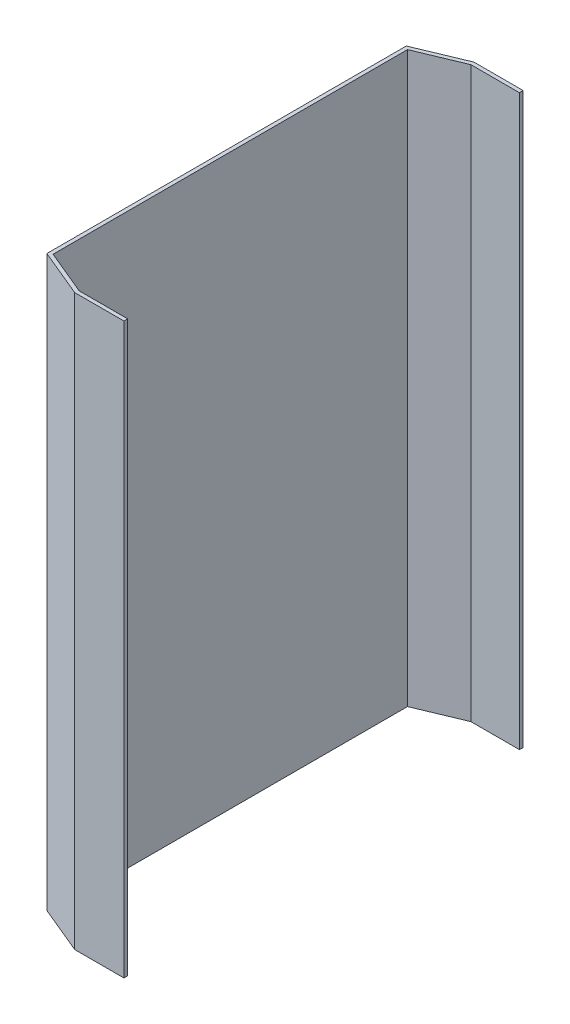
ISO-10303-21;
HEADER;
FILE_DESCRIPTION(('STEP AP214'),'2;1');
FILE_NAME('part.step','',(''),(''),'','','');
FILE_SCHEMA(('AUTOMOTIVE_DESIGN { 1 0 10303 214 1 1 1 1 }'));
ENDSEC;
DATA;
#1=APPLICATION_CONTEXT('core data for automotive mechanical design processes');
#2=APPLICATION_PROTOCOL_DEFINITION('international standard','automotive_design',2000,#1);
#3=PRODUCT_CONTEXT('',#1,'mechanical');
#4=PRODUCT('Part','Part','',(#3));
#5=PRODUCT_RELATED_PRODUCT_CATEGORY('part','',(#4));
#6=PRODUCT_DEFINITION_FORMATION('','',#4);
#7=PRODUCT_DEFINITION_CONTEXT('part definition',#1,'design');
#8=PRODUCT_DEFINITION('design','',#6,#7);
#9=PRODUCT_DEFINITION_SHAPE('','',#8);
#10=(LENGTH_UNIT() NAMED_UNIT(*) SI_UNIT(.MILLI.,.METRE.));
#11=(NAMED_UNIT(*) PLANE_ANGLE_UNIT() SI_UNIT($,.RADIAN.));
#12=(NAMED_UNIT(*) SI_UNIT($,.STERADIAN.) SOLID_ANGLE_UNIT());
#13=UNCERTAINTY_MEASURE_WITH_UNIT(LENGTH_MEASURE(1.E-05),#10,'distance_accuracy_value','');
#14=(GEOMETRIC_REPRESENTATION_CONTEXT(3) GLOBAL_UNCERTAINTY_ASSIGNED_CONTEXT((#13)) GLOBAL_UNIT_ASSIGNED_CONTEXT((#10,
#11,#12)) REPRESENTATION_CONTEXT('',''));
#15=CARTESIAN_POINT('',(0.,0.,0.));
#16=DIRECTION('',(0.,0.,1.));
#17=DIRECTION('',(1.,0.,0.));
#18=AXIS2_PLACEMENT_3D('',#15,#16,#17);
#19=CARTESIAN_POINT('',(0.,305.,-95.));
#20=DIRECTION('',(-0.384615384615384,0.,-0.923076923076923));
#21=DIRECTION('',(-0.923076923076923,0.,0.384615384615384));
#22=AXIS2_PLACEMENT_3D('',#19,#20,#21);
#23=PLANE('',#22);
#24=DIRECTION('',(0.923076923076923,0.,-0.384615384615384));
#25=VECTOR('',#24,1.);
#26=CARTESIAN_POINT('',(0.,0.,-95.));
#27=LINE('',#26,#25);
#28=CARTESIAN_POINT('',(0.,0.,-95.));
#29=VERTEX_POINT('',#28);
#30=CARTESIAN_POINT('',(24.,0.,-105.));
#31=VERTEX_POINT('',#30);
#32=EDGE_CURVE('E153',#29,#31,#27,.T.);
#33=ORIENTED_EDGE('',*,*,#32,.T.);
#34=DIRECTION('',(0.,-1.,0.));
#35=VECTOR('',#34,1.);
#36=CARTESIAN_POINT('',(24.,305.,-105.));
#37=LINE('',#36,#35);
#38=CARTESIAN_POINT('',(24.,305.,-105.));
#39=VERTEX_POINT('',#38);
#40=EDGE_CURVE('E11',#39,#31,#37,.T.);
#41=ORIENTED_EDGE('',*,*,#40,.F.);
#42=DIRECTION('',(0.923076923076923,0.,-0.384615384615384));
#43=VECTOR('',#42,1.);
#44=CARTESIAN_POINT('',(0.,305.,-95.));
#45=LINE('',#44,#43);
#46=CARTESIAN_POINT('',(0.,305.,-95.));
#47=VERTEX_POINT('',#46);
#48=EDGE_CURVE('E175',#47,#39,#45,.T.);
#49=ORIENTED_EDGE('',*,*,#48,.F.);
#50=DIRECTION('',(0.,-1.,0.));
#51=VECTOR('',#50,1.);
#52=CARTESIAN_POINT('',(0.,305.,-95.));
#53=LINE('',#52,#51);
#54=EDGE_CURVE('E149',#47,#29,#53,.T.);
#55=ORIENTED_EDGE('',*,*,#54,.T.);
#56=EDGE_LOOP('',(#33,#41,#49,#55));
#57=FACE_BOUND('',#56,.T.);
#58=ADVANCED_FACE('F33',(#57),#23,.F.);
#59=CARTESIAN_POINT('',(24.,305.,-105.));
#60=DIRECTION('',(0.,0.,-1.));
#61=DIRECTION('',(-1.,0.,0.));
#62=AXIS2_PLACEMENT_3D('',#59,#60,#61);
#63=PLANE('',#62);
#64=DIRECTION('',(1.,0.,0.));
#65=VECTOR('',#64,1.);
#66=CARTESIAN_POINT('',(24.,0.,-105.));
#67=LINE('',#66,#65);
#68=CARTESIAN_POINT('',(50.,0.,-105.));
#69=VERTEX_POINT('',#68);
#70=EDGE_CURVE('E156',#31,#69,#67,.T.);
#71=ORIENTED_EDGE('',*,*,#70,.T.);
#72=DIRECTION('',(0.,-1.,0.));
#73=VECTOR('',#72,1.);
#74=CARTESIAN_POINT('',(50.,305.,-105.));
#75=LINE('',#74,#73);
#76=CARTESIAN_POINT('',(50.,305.,-105.));
#77=VERTEX_POINT('',#76);
#78=EDGE_CURVE('E41',#77,#69,#75,.T.);
#79=ORIENTED_EDGE('',*,*,#78,.F.);
#80=DIRECTION('',(1.,0.,0.));
#81=VECTOR('',#80,1.);
#82=CARTESIAN_POINT('',(24.,305.,-105.));
#83=LINE('',#82,#81);
#84=EDGE_CURVE('E104',#39,#77,#83,.T.);
#85=ORIENTED_EDGE('',*,*,#84,.F.);
#86=ORIENTED_EDGE('',*,*,#40,.T.);
#87=EDGE_LOOP('',(#71,#79,#85,#86));
#88=FACE_BOUND('',#87,.T.);
#89=ADVANCED_FACE('F253',(#88),#63,.F.);
#90=CARTESIAN_POINT('',(50.,305.,-105.));
#91=DIRECTION('',(-1.,0.,0.));
#92=DIRECTION('',(0.,0.,1.));
#93=AXIS2_PLACEMENT_3D('',#90,#91,#92);
#94=PLANE('',#93);
#95=DIRECTION('',(0.,0.,-1.));
#96=VECTOR('',#95,1.);
#97=CARTESIAN_POINT('',(50.,0.,-105.));
#98=LINE('',#97,#96);
#99=CARTESIAN_POINT('',(50.,0.,-107.));
#100=VERTEX_POINT('',#99);
#101=EDGE_CURVE('E158',#69,#100,#98,.T.);
#102=ORIENTED_EDGE('',*,*,#101,.T.);
#103=DIRECTION('',(0.,-1.,0.));
#104=VECTOR('',#103,1.);
#105=CARTESIAN_POINT('',(50.,305.,-107.));
#106=LINE('',#105,#104);
#107=CARTESIAN_POINT('',(50.,305.,-107.));
#108=VERTEX_POINT('',#107);
#109=EDGE_CURVE('E194',#108,#100,#106,.T.);
#110=ORIENTED_EDGE('',*,*,#109,.F.);
#111=DIRECTION('',(0.,0.,-1.));
#112=VECTOR('',#111,1.);
#113=CARTESIAN_POINT('',(50.,305.,-105.));
#114=LINE('',#113,#112);
#115=EDGE_CURVE('E202',#77,#108,#114,.T.);
#116=ORIENTED_EDGE('',*,*,#115,.F.);
#117=ORIENTED_EDGE('',*,*,#78,.T.);
#118=EDGE_LOOP('',(#102,#110,#116,#117));
#119=FACE_BOUND('',#118,.T.);
#120=ADVANCED_FACE('F200',(#119),#94,.F.);
#121=CARTESIAN_POINT('',(23.6,305.,-107.));
#122=DIRECTION('',(0.,0.,1.));
#123=DIRECTION('',(1.,0.,0.));
#124=AXIS2_PLACEMENT_3D('',#121,#122,#123);
#125=PLANE('',#124);
#126=DIRECTION('',(-1.,0.,0.));
#127=VECTOR('',#126,1.);
#128=CARTESIAN_POINT('',(23.6,0.,-107.));
#129=LINE('',#128,#127);
#130=CARTESIAN_POINT('',(23.6,0.,-107.));
#131=VERTEX_POINT('',#130);
#132=EDGE_CURVE('E160',#100,#131,#129,.T.);
#133=ORIENTED_EDGE('',*,*,#132,.T.);
#134=DIRECTION('',(0.,-1.,0.));
#135=VECTOR('',#134,1.);
#136=CARTESIAN_POINT('',(23.6,305.,-107.));
#137=LINE('',#136,#135);
#138=CARTESIAN_POINT('',(23.6,305.,-107.));
#139=VERTEX_POINT('',#138);
#140=EDGE_CURVE('E191',#139,#131,#137,.T.);
#141=ORIENTED_EDGE('',*,*,#140,.F.);
#142=DIRECTION('',(-1.,0.,0.));
#143=VECTOR('',#142,1.);
#144=CARTESIAN_POINT('',(23.6,305.,-107.));
#145=LINE('',#144,#143);
#146=EDGE_CURVE('E220',#108,#139,#145,.T.);
#147=ORIENTED_EDGE('',*,*,#146,.F.);
#148=ORIENTED_EDGE('',*,*,#109,.T.);
#149=EDGE_LOOP('',(#133,#141,#147,#148));
#150=FACE_BOUND('',#149,.T.);
#151=ADVANCED_FACE('F211',(#150),#125,.F.);
#152=CARTESIAN_POINT('',(-2.00000000000001,305.,-96.3333333333333));
#153=DIRECTION('',(0.384615384615385,0.,0.923076923076923));
#154=DIRECTION('',(0.923076923076923,0.,-0.384615384615385));
#155=AXIS2_PLACEMENT_3D('',#152,#153,#154);
#156=PLANE('',#155);
#157=DIRECTION('',(-0.923076923076923,0.,0.384615384615385));
#158=VECTOR('',#157,1.);
#159=CARTESIAN_POINT('',(-2.00000000000001,0.,-96.3333333333333));
#160=LINE('',#159,#158);
#161=CARTESIAN_POINT('',(-2.00000000000001,0.,-96.3333333333333));
#162=VERTEX_POINT('',#161);
#163=EDGE_CURVE('E162',#131,#162,#160,.T.);
#164=ORIENTED_EDGE('',*,*,#163,.T.);
#165=DIRECTION('',(0.,-1.,0.));
#166=VECTOR('',#165,1.);
#167=CARTESIAN_POINT('',(-2.00000000000001,305.,-96.3333333333333));
#168=LINE('',#167,#166);
#169=CARTESIAN_POINT('',(-2.00000000000001,305.,-96.3333333333333));
#170=VERTEX_POINT('',#169);
#171=EDGE_CURVE('E188',#170,#162,#168,.T.);
#172=ORIENTED_EDGE('',*,*,#171,.F.);
#173=DIRECTION('',(-0.923076923076923,0.,0.384615384615385));
#174=VECTOR('',#173,1.);
#175=CARTESIAN_POINT('',(-2.00000000000001,305.,-96.3333333333333));
#176=LINE('',#175,#174);
#177=EDGE_CURVE('E217',#139,#170,#176,.T.);
#178=ORIENTED_EDGE('',*,*,#177,.F.);
#179=ORIENTED_EDGE('',*,*,#140,.T.);
#180=EDGE_LOOP('',(#164,#172,#178,#179));
#181=FACE_BOUND('',#180,.T.);
#182=ADVANCED_FACE('F215',(#181),#156,.F.);
#183=CARTESIAN_POINT('',(-2.00000000000001,305.,-96.3333333333333));
#184=DIRECTION('',(1.,0.,0.));
#185=DIRECTION('',(0.,0.,-1.));
#186=AXIS2_PLACEMENT_3D('',#183,#184,#185);
#187=PLANE('',#186);
#188=DIRECTION('',(0.,0.,1.));
#189=VECTOR('',#188,1.);
#190=CARTESIAN_POINT('',(-2.00000000000001,0.,-96.3333333333333));
#191=LINE('',#190,#189);
#192=CARTESIAN_POINT('',(-2.00000000000001,0.,96.3333333333333));
#193=VERTEX_POINT('',#192);
#194=EDGE_CURVE('E164',#162,#193,#191,.T.);
#195=ORIENTED_EDGE('',*,*,#194,.T.);
#196=DIRECTION('',(0.,-1.,0.));
#197=VECTOR('',#196,1.);
#198=CARTESIAN_POINT('',(-2.00000000000001,305.,96.3333333333333));
#199=LINE('',#198,#197);
#200=CARTESIAN_POINT('',(-2.00000000000001,305.,96.3333333333333));
#201=VERTEX_POINT('',#200);
#202=EDGE_CURVE('E185',#201,#193,#199,.T.);
#203=ORIENTED_EDGE('',*,*,#202,.F.);
#204=DIRECTION('',(0.,0.,1.));
#205=VECTOR('',#204,1.);
#206=CARTESIAN_POINT('',(-2.00000000000001,305.,-96.3333333333333));
#207=LINE('',#206,#205);
#208=EDGE_CURVE('E219',#170,#201,#207,.T.);
#209=ORIENTED_EDGE('',*,*,#208,.F.);
#210=ORIENTED_EDGE('',*,*,#171,.T.);
#211=EDGE_LOOP('',(#195,#203,#209,#210));
#212=FACE_BOUND('',#211,.T.);
#213=ADVANCED_FACE('F266',(#212),#187,.F.);
#214=CARTESIAN_POINT('',(-2.00000000000001,305.,96.3333333333333));
#215=DIRECTION('',(0.384615384615384,0.,-0.923076923076923));
#216=DIRECTION('',(-0.923076923076923,0.,-0.384615384615384));
#217=AXIS2_PLACEMENT_3D('',#214,#215,#216);
#218=PLANE('',#217);
#219=DIRECTION('',(0.923076923076923,0.,0.384615384615384));
#220=VECTOR('',#219,1.);
#221=CARTESIAN_POINT('',(-2.00000000000001,0.,96.3333333333333));
#222=LINE('',#221,#220);
#223=CARTESIAN_POINT('',(23.6,0.,107.));
#224=VERTEX_POINT('',#223);
#225=EDGE_CURVE('E166',#193,#224,#222,.T.);
#226=ORIENTED_EDGE('',*,*,#225,.T.);
#227=DIRECTION('',(0.,-1.,0.));
#228=VECTOR('',#227,1.);
#229=CARTESIAN_POINT('',(23.6,305.,107.));
#230=LINE('',#229,#228);
#231=CARTESIAN_POINT('',(23.6,305.,107.));
#232=VERTEX_POINT('',#231);
#233=EDGE_CURVE('E182',#232,#224,#230,.T.);
#234=ORIENTED_EDGE('',*,*,#233,.F.);
#235=DIRECTION('',(0.923076923076923,0.,0.384615384615384));
#236=VECTOR('',#235,1.);
#237=CARTESIAN_POINT('',(-2.00000000000001,305.,96.3333333333333));
#238=LINE('',#237,#236);
#239=EDGE_CURVE('E222',#201,#232,#238,.T.);
#240=ORIENTED_EDGE('',*,*,#239,.F.);
#241=ORIENTED_EDGE('',*,*,#202,.T.);
#242=EDGE_LOOP('',(#226,#234,#240,#241));
#243=FACE_BOUND('',#242,.T.);
#244=ADVANCED_FACE('F269',(#243),#218,.F.);
#245=CARTESIAN_POINT('',(23.6,305.,107.));
#246=DIRECTION('',(0.,0.,-1.));
#247=DIRECTION('',(-1.,0.,0.));
#248=AXIS2_PLACEMENT_3D('',#245,#246,#247);
#249=PLANE('',#248);
#250=DIRECTION('',(1.,0.,0.));
#251=VECTOR('',#250,1.);
#252=CARTESIAN_POINT('',(23.6,0.,107.));
#253=LINE('',#252,#251);
#254=CARTESIAN_POINT('',(50.,0.,107.));
#255=VERTEX_POINT('',#254);
#256=EDGE_CURVE('E168',#224,#255,#253,.T.);
#257=ORIENTED_EDGE('',*,*,#256,.T.);
#258=DIRECTION('',(0.,-1.,0.));
#259=VECTOR('',#258,1.);
#260=CARTESIAN_POINT('',(50.,305.,107.));
#261=LINE('',#260,#259);
#262=CARTESIAN_POINT('',(50.,305.,107.));
#263=VERTEX_POINT('',#262);
#264=EDGE_CURVE('E179',#263,#255,#261,.T.);
#265=ORIENTED_EDGE('',*,*,#264,.F.);
#266=DIRECTION('',(1.,0.,0.));
#267=VECTOR('',#266,1.);
#268=CARTESIAN_POINT('',(23.6,305.,107.));
#269=LINE('',#268,#267);
#270=EDGE_CURVE('E228',#232,#263,#269,.T.);
#271=ORIENTED_EDGE('',*,*,#270,.F.);
#272=ORIENTED_EDGE('',*,*,#233,.T.);
#273=EDGE_LOOP('',(#257,#265,#271,#272));
#274=FACE_BOUND('',#273,.T.);
#275=ADVANCED_FACE('F234',(#274),#249,.F.);
#276=CARTESIAN_POINT('',(50.,305.,107.));
#277=DIRECTION('',(-1.,0.,0.));
#278=DIRECTION('',(0.,0.,1.));
#279=AXIS2_PLACEMENT_3D('',#276,#277,#278);
#280=PLANE('',#279);
#281=DIRECTION('',(0.,0.,-1.));
#282=VECTOR('',#281,1.);
#283=CARTESIAN_POINT('',(50.,0.,107.));
#284=LINE('',#283,#282);
#285=CARTESIAN_POINT('',(50.,0.,105.));
#286=VERTEX_POINT('',#285);
#287=EDGE_CURVE('E170',#255,#286,#284,.T.);
#288=ORIENTED_EDGE('',*,*,#287,.T.);
#289=DIRECTION('',(0.,-1.,0.));
#290=VECTOR('',#289,1.);
#291=CARTESIAN_POINT('',(50.,305.,105.));
#292=LINE('',#291,#290);
#293=CARTESIAN_POINT('',(50.,305.,105.));
#294=VERTEX_POINT('',#293);
#295=EDGE_CURVE('E144',#294,#286,#292,.T.);
#296=ORIENTED_EDGE('',*,*,#295,.F.);
#297=DIRECTION('',(0.,0.,-1.));
#298=VECTOR('',#297,1.);
#299=CARTESIAN_POINT('',(50.,305.,107.));
#300=LINE('',#299,#298);
#301=EDGE_CURVE('E135',#263,#294,#300,.T.);
#302=ORIENTED_EDGE('',*,*,#301,.F.);
#303=ORIENTED_EDGE('',*,*,#264,.T.);
#304=EDGE_LOOP('',(#288,#296,#302,#303));
#305=FACE_BOUND('',#304,.T.);
#306=ADVANCED_FACE('F238',(#305),#280,.F.);
#307=CARTESIAN_POINT('',(24.,305.,105.));
#308=DIRECTION('',(0.,0.,1.));
#309=DIRECTION('',(1.,0.,0.));
#310=AXIS2_PLACEMENT_3D('',#307,#308,#309);
#311=PLANE('',#310);
#312=DIRECTION('',(-1.,0.,0.));
#313=VECTOR('',#312,1.);
#314=CARTESIAN_POINT('',(24.,0.,105.));
#315=LINE('',#314,#313);
#316=CARTESIAN_POINT('',(24.,0.,105.));
#317=VERTEX_POINT('',#316);
#318=EDGE_CURVE('E143',#286,#317,#315,.T.);
#319=ORIENTED_EDGE('',*,*,#318,.T.);
#320=DIRECTION('',(0.,-1.,0.));
#321=VECTOR('',#320,1.);
#322=CARTESIAN_POINT('',(24.,305.,105.));
#323=LINE('',#322,#321);
#324=CARTESIAN_POINT('',(24.,305.,105.));
#325=VERTEX_POINT('',#324);
#326=EDGE_CURVE('E140',#325,#317,#323,.T.);
#327=ORIENTED_EDGE('',*,*,#326,.F.);
#328=DIRECTION('',(-1.,0.,0.));
#329=VECTOR('',#328,1.);
#330=CARTESIAN_POINT('',(24.,305.,105.));
#331=LINE('',#330,#329);
#332=EDGE_CURVE('E129',#294,#325,#331,.T.);
#333=ORIENTED_EDGE('',*,*,#332,.F.);
#334=ORIENTED_EDGE('',*,*,#295,.T.);
#335=EDGE_LOOP('',(#319,#327,#333,#334));
#336=FACE_BOUND('',#335,.T.);
#337=ADVANCED_FACE('F141',(#336),#311,.F.);
#338=CARTESIAN_POINT('',(0.,305.,95.));
#339=DIRECTION('',(-0.384615384615384,0.,0.923076923076923));
#340=DIRECTION('',(0.923076923076923,0.,0.384615384615384));
#341=AXIS2_PLACEMENT_3D('',#338,#339,#340);
#342=PLANE('',#341);
#343=DIRECTION('',(-0.923076923076923,0.,-0.384615384615384));
#344=VECTOR('',#343,1.);
#345=CARTESIAN_POINT('',(0.,0.,95.));
#346=LINE('',#345,#344);
#347=CARTESIAN_POINT('',(0.,0.,95.));
#348=VERTEX_POINT('',#347);
#349=EDGE_CURVE('E90',#317,#348,#346,.T.);
#350=ORIENTED_EDGE('',*,*,#349,.T.);
#351=DIRECTION('',(0.,-1.,0.));
#352=VECTOR('',#351,1.);
#353=CARTESIAN_POINT('',(0.,305.,95.));
#354=LINE('',#353,#352);
#355=CARTESIAN_POINT('',(0.,305.,95.));
#356=VERTEX_POINT('',#355);
#357=EDGE_CURVE('E145',#356,#348,#354,.T.);
#358=ORIENTED_EDGE('',*,*,#357,.F.);
#359=DIRECTION('',(-0.923076923076923,0.,-0.384615384615384));
#360=VECTOR('',#359,1.);
#361=CARTESIAN_POINT('',(0.,305.,95.));
#362=LINE('',#361,#360);
#363=EDGE_CURVE('E133',#325,#356,#362,.T.);
#364=ORIENTED_EDGE('',*,*,#363,.F.);
#365=ORIENTED_EDGE('',*,*,#326,.T.);
#366=EDGE_LOOP('',(#350,#358,#364,#365));
#367=FACE_BOUND('',#366,.T.);
#368=ADVANCED_FACE('F147',(#367),#342,.F.);
#369=CARTESIAN_POINT('',(0.,305.,-95.));
#370=DIRECTION('',(-1.,0.,0.));
#371=DIRECTION('',(0.,0.,1.));
#372=AXIS2_PLACEMENT_3D('',#369,#370,#371);
#373=PLANE('',#372);
#374=DIRECTION('',(0.,0.,-1.));
#375=VECTOR('',#374,1.);
#376=CARTESIAN_POINT('',(0.,0.,-95.));
#377=LINE('',#376,#375);
#378=EDGE_CURVE('E96',#348,#29,#377,.T.);
#379=ORIENTED_EDGE('',*,*,#378,.T.);
#380=ORIENTED_EDGE('',*,*,#54,.F.);
#381=DIRECTION('',(0.,0.,-1.));
#382=VECTOR('',#381,1.);
#383=CARTESIAN_POINT('',(0.,305.,-95.));
#384=LINE('',#383,#382);
#385=EDGE_CURVE('E49',#356,#47,#384,.T.);
#386=ORIENTED_EDGE('',*,*,#385,.F.);
#387=ORIENTED_EDGE('',*,*,#357,.T.);
#388=EDGE_LOOP('',(#379,#380,#386,#387));
#389=FACE_BOUND('',#388,.T.);
#390=ADVANCED_FACE('F242',(#389),#373,.F.);
#391=CARTESIAN_POINT('',(0.,305.,0.));
#392=DIRECTION('',(0.,1.,0.));
#393=DIRECTION('',(0.,0.,1.));
#394=AXIS2_PLACEMENT_3D('',#391,#392,#393);
#395=PLANE('',#394);
#396=ORIENTED_EDGE('',*,*,#48,.T.);
#397=ORIENTED_EDGE('',*,*,#84,.T.);
#398=ORIENTED_EDGE('',*,*,#115,.T.);
#399=ORIENTED_EDGE('',*,*,#146,.T.);
#400=ORIENTED_EDGE('',*,*,#177,.T.);
#401=ORIENTED_EDGE('',*,*,#208,.T.);
#402=ORIENTED_EDGE('',*,*,#239,.T.);
#403=ORIENTED_EDGE('',*,*,#270,.T.);
#404=ORIENTED_EDGE('',*,*,#301,.T.);
#405=ORIENTED_EDGE('',*,*,#332,.T.);
#406=ORIENTED_EDGE('',*,*,#363,.T.);
#407=ORIENTED_EDGE('',*,*,#385,.T.);
#408=EDGE_LOOP('',(#396,#397,#398,#399,#400,#401,#402,#403,#404,#405,#406,#407));
#409=FACE_BOUND('',#408,.T.);
#410=ADVANCED_FACE('F131',(#409),#395,.T.);
#411=CARTESIAN_POINT('',(0.,0.,0.));
#412=DIRECTION('',(0.,1.,0.));
#413=DIRECTION('',(0.,0.,1.));
#414=AXIS2_PLACEMENT_3D('',#411,#412,#413);
#415=PLANE('',#414);
#416=ORIENTED_EDGE('',*,*,#32,.F.);
#417=ORIENTED_EDGE('',*,*,#378,.F.);
#418=ORIENTED_EDGE('',*,*,#349,.F.);
#419=ORIENTED_EDGE('',*,*,#318,.F.);
#420=ORIENTED_EDGE('',*,*,#287,.F.);
#421=ORIENTED_EDGE('',*,*,#256,.F.);
#422=ORIENTED_EDGE('',*,*,#225,.F.);
#423=ORIENTED_EDGE('',*,*,#194,.F.);
#424=ORIENTED_EDGE('',*,*,#163,.F.);
#425=ORIENTED_EDGE('',*,*,#132,.F.);
#426=ORIENTED_EDGE('',*,*,#101,.F.);
#427=ORIENTED_EDGE('',*,*,#70,.F.);
#428=EDGE_LOOP('',(#416,#417,#418,#419,#420,#421,#422,#423,#424,#425,#426,#427));
#429=FACE_BOUND('',#428,.T.);
#430=ADVANCED_FACE('F206',(#429),#415,.F.);
#431=CLOSED_SHELL('',(#58,#89,#120,#151,#182,#213,#244,#275,#306,#337,#368,#390,#410,#430));
#432=MANIFOLD_SOLID_BREP('B2',#431);
#433=ADVANCED_BREP_SHAPE_REPRESENTATION('',(#18,#432),#14);
#434=SHAPE_DEFINITION_REPRESENTATION(#9,#433);
ENDSEC;
END-ISO-10303-21;
